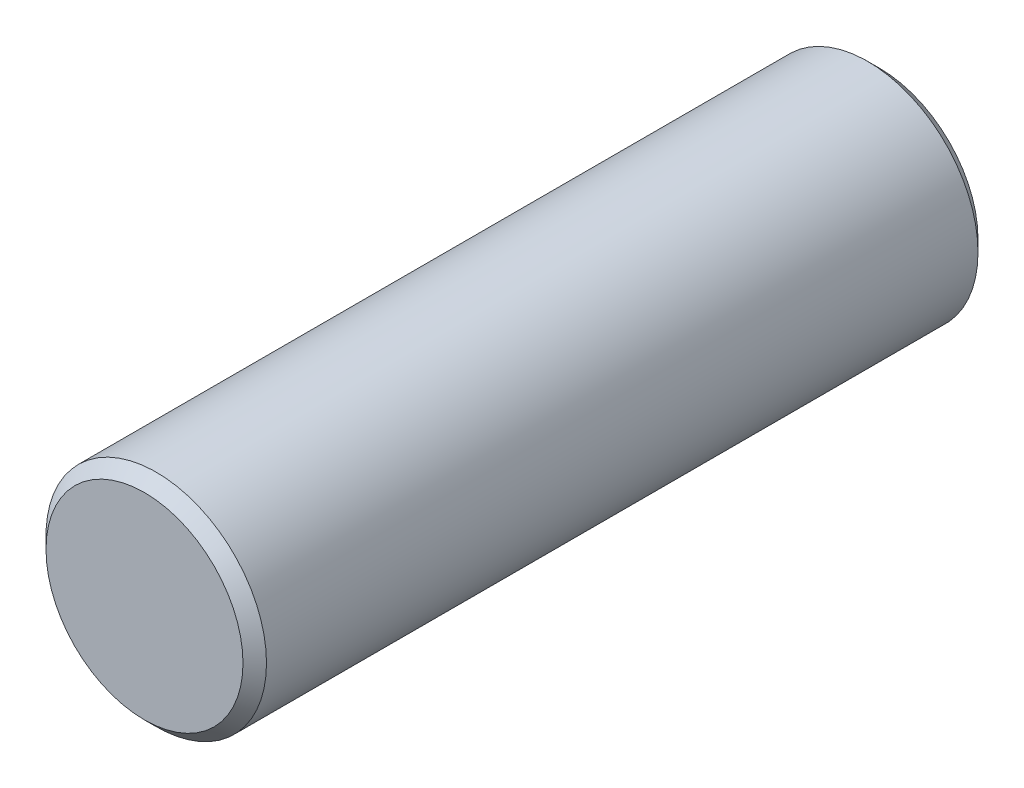
ISO-10303-21;
HEADER;
FILE_DESCRIPTION(('STEP AP214'),'2;1');
FILE_NAME('part.step','',(''),(''),'','','');
FILE_SCHEMA(('AUTOMOTIVE_DESIGN { 1 0 10303 214 1 1 1 1 }'));
ENDSEC;
DATA;
#1=APPLICATION_CONTEXT('core data for automotive mechanical design processes');
#2=APPLICATION_PROTOCOL_DEFINITION('international standard','automotive_design',2000,#1);
#3=PRODUCT_CONTEXT('',#1,'mechanical');
#4=PRODUCT('Part','Part','',(#3));
#5=PRODUCT_RELATED_PRODUCT_CATEGORY('part','',(#4));
#6=PRODUCT_DEFINITION_FORMATION('','',#4);
#7=PRODUCT_DEFINITION_CONTEXT('part definition',#1,'design');
#8=PRODUCT_DEFINITION('design','',#6,#7);
#9=PRODUCT_DEFINITION_SHAPE('','',#8);
#10=(LENGTH_UNIT() NAMED_UNIT(*) SI_UNIT(.MILLI.,.METRE.));
#11=(NAMED_UNIT(*) PLANE_ANGLE_UNIT() SI_UNIT($,.RADIAN.));
#12=(NAMED_UNIT(*) SI_UNIT($,.STERADIAN.) SOLID_ANGLE_UNIT());
#13=UNCERTAINTY_MEASURE_WITH_UNIT(LENGTH_MEASURE(1.E-05),#10,'distance_accuracy_value','');
#14=(GEOMETRIC_REPRESENTATION_CONTEXT(3) GLOBAL_UNCERTAINTY_ASSIGNED_CONTEXT((#13)) GLOBAL_UNIT_ASSIGNED_CONTEXT((#10,
#11,#12)) REPRESENTATION_CONTEXT('',''));
#15=CARTESIAN_POINT('',(0.,0.,0.));
#16=DIRECTION('',(0.,0.,1.));
#17=DIRECTION('',(1.,0.,0.));
#18=AXIS2_PLACEMENT_3D('',#15,#16,#17);
#19=CARTESIAN_POINT('',(0.,0.,15.875));
#20=DIRECTION('',(0.,0.,-1.));
#21=DIRECTION('',(-1.,0.,0.));
#22=AXIS2_PLACEMENT_3D('',#19,#20,#21);
#23=CYLINDRICAL_SURFACE('',#22,2.38125);
#24=CARTESIAN_POINT('',(0.,0.,0.254000000000003));
#25=DIRECTION('',(0.,0.,1.));
#26=DIRECTION('',(1.,0.,0.));
#27=AXIS2_PLACEMENT_3D('',#24,#25,#26);
#28=CIRCLE('',#27,2.38125);
#29=CARTESIAN_POINT('',(2.38125,0.,0.254000000000003));
#30=VERTEX_POINT('',#29);
#31=EDGE_CURVE('E53',#30,#30,#28,.T.);
#32=ORIENTED_EDGE('',*,*,#31,.T.);
#33=EDGE_LOOP('',(#32));
#34=FACE_BOUND('',#33,.T.);
#35=CARTESIAN_POINT('',(0.,0.,15.621));
#36=DIRECTION('',(0.,0.,1.));
#37=DIRECTION('',(1.,0.,0.));
#38=AXIS2_PLACEMENT_3D('',#35,#36,#37);
#39=CIRCLE('',#38,2.38125);
#40=CARTESIAN_POINT('',(2.38125,0.,15.621));
#41=VERTEX_POINT('',#40);
#42=EDGE_CURVE('E58',#41,#41,#39,.F.);
#43=ORIENTED_EDGE('',*,*,#42,.T.);
#44=EDGE_LOOP('',(#43));
#45=FACE_BOUND('',#44,.T.);
#46=ADVANCED_FACE('F39',(#34,#45),#23,.T.);
#47=CARTESIAN_POINT('',(0.,0.,15.875));
#48=DIRECTION('',(0.,0.,1.));
#49=DIRECTION('',(1.,0.,0.));
#50=AXIS2_PLACEMENT_3D('',#47,#48,#49);
#51=PLANE('',#50);
#52=CARTESIAN_POINT('',(0.,0.,15.875));
#53=DIRECTION('',(0.,0.,1.));
#54=DIRECTION('',(1.,0.,0.));
#55=AXIS2_PLACEMENT_3D('',#52,#53,#54);
#56=CIRCLE('',#55,2.12725);
#57=CARTESIAN_POINT('',(2.12725,0.,15.875));
#58=VERTEX_POINT('',#57);
#59=EDGE_CURVE('E10',#58,#58,#56,.T.);
#60=ORIENTED_EDGE('',*,*,#59,.T.);
#61=EDGE_LOOP('',(#60));
#62=FACE_BOUND('',#61,.T.);
#63=ADVANCED_FACE('F75',(#62),#51,.T.);
#64=CARTESIAN_POINT('',(0.,0.,0.));
#65=DIRECTION('',(0.,0.,1.));
#66=DIRECTION('',(1.,0.,0.));
#67=AXIS2_PLACEMENT_3D('',#64,#65,#66);
#68=PLANE('',#67);
#69=CARTESIAN_POINT('',(0.,0.,0.));
#70=DIRECTION('',(0.,0.,1.));
#71=DIRECTION('',(1.,0.,0.));
#72=AXIS2_PLACEMENT_3D('',#69,#70,#71);
#73=CIRCLE('',#72,2.12725);
#74=CARTESIAN_POINT('',(2.12725,0.,0.));
#75=VERTEX_POINT('',#74);
#76=EDGE_CURVE('E48',#75,#75,#73,.F.);
#77=ORIENTED_EDGE('',*,*,#76,.T.);
#78=EDGE_LOOP('',(#77));
#79=FACE_BOUND('',#78,.T.);
#80=ADVANCED_FACE('F72',(#79),#68,.F.);
#81=CARTESIAN_POINT('',(0.,0.,0.254000000000003));
#82=DIRECTION('',(0.,0.,1.));
#83=DIRECTION('',(1.,0.,0.));
#84=AXIS2_PLACEMENT_3D('',#81,#82,#83);
#85=CONICAL_SURFACE('',#84,2.38125,0.785398163397452);
#86=ORIENTED_EDGE('',*,*,#76,.F.);
#87=EDGE_LOOP('',(#86));
#88=FACE_BOUND('',#87,.T.);
#89=ORIENTED_EDGE('',*,*,#31,.F.);
#90=EDGE_LOOP('',(#89));
#91=FACE_BOUND('',#90,.T.);
#92=ADVANCED_FACE('F68',(#88,#91),#85,.T.);
#93=CARTESIAN_POINT('',(0.,0.,15.875));
#94=DIRECTION('',(0.,0.,-1.));
#95=DIRECTION('',(-1.,0.,0.));
#96=AXIS2_PLACEMENT_3D('',#93,#94,#95);
#97=CONICAL_SURFACE('',#96,2.12725,0.785398163397442);
#98=ORIENTED_EDGE('',*,*,#42,.F.);
#99=EDGE_LOOP('',(#98));
#100=FACE_BOUND('',#99,.T.);
#101=ORIENTED_EDGE('',*,*,#59,.F.);
#102=EDGE_LOOP('',(#101));
#103=FACE_BOUND('',#102,.T.);
#104=ADVANCED_FACE('F42',(#100,#103),#97,.T.);
#105=CLOSED_SHELL('',(#46,#63,#80,#92,#104));
#106=MANIFOLD_SOLID_BREP('B2',#105);
#107=ADVANCED_BREP_SHAPE_REPRESENTATION('',(#18,#106),#14);
#108=SHAPE_DEFINITION_REPRESENTATION(#9,#107);
ENDSEC;
END-ISO-10303-21;
